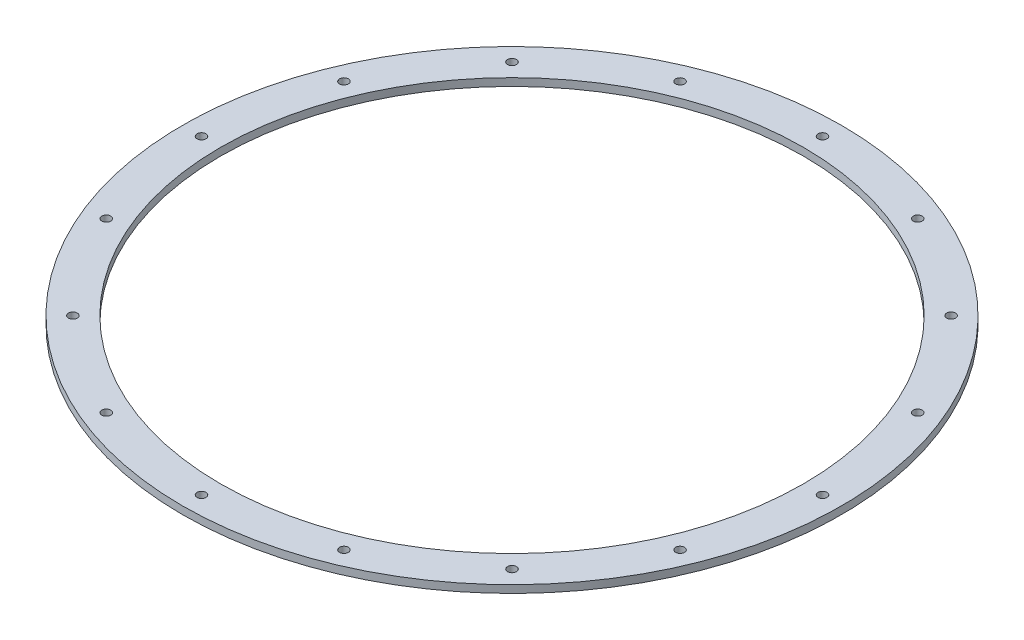
ISO-10303-21;
HEADER;
FILE_DESCRIPTION(('STEP AP214'),'2;1');
FILE_NAME('part.step','',(''),(''),'','','');
FILE_SCHEMA(('AUTOMOTIVE_DESIGN { 1 0 10303 214 1 1 1 1 }'));
ENDSEC;
DATA;
#1=APPLICATION_CONTEXT('core data for automotive mechanical design processes');
#2=APPLICATION_PROTOCOL_DEFINITION('international standard','automotive_design',2000,#1);
#3=PRODUCT_CONTEXT('',#1,'mechanical');
#4=PRODUCT('Part','Part','',(#3));
#5=PRODUCT_RELATED_PRODUCT_CATEGORY('part','',(#4));
#6=PRODUCT_DEFINITION_FORMATION('','',#4);
#7=PRODUCT_DEFINITION_CONTEXT('part definition',#1,'design');
#8=PRODUCT_DEFINITION('design','',#6,#7);
#9=PRODUCT_DEFINITION_SHAPE('','',#8);
#10=(LENGTH_UNIT() NAMED_UNIT(*) SI_UNIT(.MILLI.,.METRE.));
#11=(NAMED_UNIT(*) PLANE_ANGLE_UNIT() SI_UNIT($,.RADIAN.));
#12=(NAMED_UNIT(*) SI_UNIT($,.STERADIAN.) SOLID_ANGLE_UNIT());
#13=UNCERTAINTY_MEASURE_WITH_UNIT(LENGTH_MEASURE(1.E-05),#10,'distance_accuracy_value','');
#14=(GEOMETRIC_REPRESENTATION_CONTEXT(3) GLOBAL_UNCERTAINTY_ASSIGNED_CONTEXT((#13)) GLOBAL_UNIT_ASSIGNED_CONTEXT((#10,
#11,#12)) REPRESENTATION_CONTEXT('',''));
#15=CARTESIAN_POINT('',(0.,0.,0.));
#16=DIRECTION('',(0.,0.,1.));
#17=DIRECTION('',(1.,0.,0.));
#18=AXIS2_PLACEMENT_3D('',#15,#16,#17);
#19=CARTESIAN_POINT('',(0.,3.,0.));
#20=DIRECTION('',(0.,1.,0.));
#21=DIRECTION('',(0.,0.,1.));
#22=AXIS2_PLACEMENT_3D('',#19,#20,#21);
#23=PLANE('',#22);
#24=CARTESIAN_POINT('',(-172.887608000097,3.,-172.887608000076));
#25=DIRECTION('',(0.,1.,0.));
#26=DIRECTION('',(0.,0.,1.));
#27=AXIS2_PLACEMENT_3D('',#24,#25,#26);
#28=CIRCLE('',#27,3.49999999999999);
#29=CARTESIAN_POINT('',(-172.887608000097,3.,-169.387608000076));
#30=VERTEX_POINT('',#29);
#31=EDGE_CURVE('E134',#30,#30,#28,.T.);
#32=ORIENTED_EDGE('',*,*,#31,.F.);
#33=EDGE_LOOP('',(#32));
#34=FACE_BOUND('',#33,.T.);
#35=CARTESIAN_POINT('',(-244.499999999951,3.,4.86287843830169E-11));
#36=DIRECTION('',(0.,1.,0.));
#37=DIRECTION('',(0.,0.,1.));
#38=AXIS2_PLACEMENT_3D('',#35,#36,#37);
#39=CIRCLE('',#38,3.49999999999999);
#40=CARTESIAN_POINT('',(-244.499999999951,3.,3.50000000004862));
#41=VERTEX_POINT('',#40);
#42=EDGE_CURVE('E122',#41,#41,#39,.T.);
#43=ORIENTED_EDGE('',*,*,#42,.F.);
#44=EDGE_LOOP('',(#43));
#45=FACE_BOUND('',#44,.T.);
#46=CARTESIAN_POINT('',(-172.887608000028,3.,172.887608000145));
#47=DIRECTION('',(0.,1.,0.));
#48=DIRECTION('',(0.,0.,1.));
#49=AXIS2_PLACEMENT_3D('',#46,#47,#48);
#50=CIRCLE('',#49,3.49999999999999);
#51=CARTESIAN_POINT('',(-172.887608000028,3.,176.387608000145));
#52=VERTEX_POINT('',#51);
#53=EDGE_CURVE('E110',#52,#52,#50,.T.);
#54=ORIENTED_EDGE('',*,*,#53,.F.);
#55=EDGE_LOOP('',(#54));
#56=FACE_BOUND('',#55,.T.);
#57=CARTESIAN_POINT('',(9.71976835375555E-11,3.,244.5));
#58=DIRECTION('',(0.,1.,0.));
#59=DIRECTION('',(0.,0.,1.));
#60=AXIS2_PLACEMENT_3D('',#57,#58,#59);
#61=CIRCLE('',#60,3.5);
#62=CARTESIAN_POINT('',(9.71976835375555E-11,3.,248.));
#63=VERTEX_POINT('',#62);
#64=EDGE_CURVE('E98',#63,#63,#61,.T.);
#65=ORIENTED_EDGE('',*,*,#64,.F.);
#66=EDGE_LOOP('',(#65));
#67=FACE_BOUND('',#66,.T.);
#68=CARTESIAN_POINT('',(172.887608000194,3.,172.887608000076));
#69=DIRECTION('',(0.,1.,0.));
#70=DIRECTION('',(0.,0.,1.));
#71=AXIS2_PLACEMENT_3D('',#68,#69,#70);
#72=CIRCLE('',#71,3.49999999999999);
#73=CARTESIAN_POINT('',(172.887608000194,3.,176.387608000076));
#74=VERTEX_POINT('',#73);
#75=EDGE_CURVE('E86',#74,#74,#72,.T.);
#76=ORIENTED_EDGE('',*,*,#75,.F.);
#77=EDGE_LOOP('',(#76));
#78=FACE_BOUND('',#77,.T.);
#79=CARTESIAN_POINT('',(244.500000000049,3.,-4.85988417687777E-11));
#80=DIRECTION('',(0.,1.,0.));
#81=DIRECTION('',(0.,0.,1.));
#82=AXIS2_PLACEMENT_3D('',#79,#80,#81);
#83=CIRCLE('',#82,3.49999999999999);
#84=CARTESIAN_POINT('',(244.500000000049,3.,3.49999999995139));
#85=VERTEX_POINT('',#84);
#86=EDGE_CURVE('E74',#85,#85,#83,.T.);
#87=ORIENTED_EDGE('',*,*,#86,.F.);
#88=EDGE_LOOP('',(#87));
#89=FACE_BOUND('',#88,.T.);
#90=CARTESIAN_POINT('',(172.887608000125,3.,-172.887608000145));
#91=DIRECTION('',(0.,1.,0.));
#92=DIRECTION('',(0.,0.,1.));
#93=AXIS2_PLACEMENT_3D('',#90,#91,#92);
#94=CIRCLE('',#93,3.49999999999999);
#95=CARTESIAN_POINT('',(172.887608000125,3.,-169.387608000145));
#96=VERTEX_POINT('',#95);
#97=EDGE_CURVE('E62',#96,#96,#94,.T.);
#98=ORIENTED_EDGE('',*,*,#97,.F.);
#99=EDGE_LOOP('',(#98));
#100=FACE_BOUND('',#99,.T.);
#101=CARTESIAN_POINT('',(0.,3.,-244.5));
#102=DIRECTION('',(0.,1.,0.));
#103=DIRECTION('',(0.,0.,1.));
#104=AXIS2_PLACEMENT_3D('',#101,#102,#103);
#105=CIRCLE('',#104,3.5);
#106=CARTESIAN_POINT('',(0.,3.,-241.));
#107=VERTEX_POINT('',#106);
#108=EDGE_CURVE('E50',#107,#107,#105,.T.);
#109=ORIENTED_EDGE('',*,*,#108,.F.);
#110=EDGE_LOOP('',(#109));
#111=FACE_BOUND('',#110,.T.);
#112=CARTESIAN_POINT('',(0.,3.,0.));
#113=DIRECTION('',(0.,1.,0.));
#114=DIRECTION('',(0.,0.,1.));
#115=AXIS2_PLACEMENT_3D('',#112,#113,#114);
#116=CIRCLE('',#115,259.5);
#117=CARTESIAN_POINT('',(0.,3.,259.5));
#118=VERTEX_POINT('',#117);
#119=EDGE_CURVE('E10',#118,#118,#116,.T.);
#120=ORIENTED_EDGE('',*,*,#119,.T.);
#121=EDGE_LOOP('',(#120));
#122=FACE_BOUND('',#121,.T.);
#123=CARTESIAN_POINT('',(0.,3.,0.));
#124=DIRECTION('',(0.,1.,0.));
#125=DIRECTION('',(0.,0.,1.));
#126=AXIS2_PLACEMENT_3D('',#123,#124,#125);
#127=CIRCLE('',#126,229.5);
#128=CARTESIAN_POINT('',(0.,3.,229.5));
#129=VERTEX_POINT('',#128);
#130=EDGE_CURVE('E45',#129,#129,#127,.T.);
#131=ORIENTED_EDGE('',*,*,#130,.F.);
#132=EDGE_LOOP('',(#131));
#133=FACE_BOUND('',#132,.T.);
#134=CARTESIAN_POINT('',(93.566099213268,3.,-225.888545699028));
#135=DIRECTION('',(0.,1.,0.));
#136=DIRECTION('',(0.,0.,1.));
#137=AXIS2_PLACEMENT_3D('',#134,#135,#136);
#138=CIRCLE('',#137,3.50000000000001);
#139=CARTESIAN_POINT('',(93.566099213268,3.,-222.388545699028));
#140=VERTEX_POINT('',#139);
#141=EDGE_CURVE('E56',#140,#140,#138,.T.);
#142=ORIENTED_EDGE('',*,*,#141,.F.);
#143=EDGE_LOOP('',(#142));
#144=FACE_BOUND('',#143,.T.);
#145=CARTESIAN_POINT('',(225.88854569904,3.,-93.5660992133093));
#146=DIRECTION('',(0.,1.,0.));
#147=DIRECTION('',(0.,0.,1.));
#148=AXIS2_PLACEMENT_3D('',#145,#146,#147);
#149=CIRCLE('',#148,3.49999999999999);
#150=CARTESIAN_POINT('',(225.88854569904,3.,-90.0660992133094));
#151=VERTEX_POINT('',#150);
#152=EDGE_CURVE('E68',#151,#151,#149,.T.);
#153=ORIENTED_EDGE('',*,*,#152,.F.);
#154=EDGE_LOOP('',(#153));
#155=FACE_BOUND('',#154,.T.);
#156=CARTESIAN_POINT('',(225.888545699077,3.,93.5660992132196));
#157=DIRECTION('',(0.,1.,0.));
#158=DIRECTION('',(0.,0.,1.));
#159=AXIS2_PLACEMENT_3D('',#156,#157,#158);
#160=CIRCLE('',#159,3.49999999999999);
#161=CARTESIAN_POINT('',(225.888545699077,3.,97.0660992132195));
#162=VERTEX_POINT('',#161);
#163=EDGE_CURVE('E80',#162,#162,#160,.T.);
#164=ORIENTED_EDGE('',*,*,#163,.F.);
#165=EDGE_LOOP('',(#164));
#166=FACE_BOUND('',#165,.T.);
#167=CARTESIAN_POINT('',(93.5660992133579,3.,225.888545698991));
#168=DIRECTION('',(0.,1.,0.));
#169=DIRECTION('',(0.,0.,1.));
#170=AXIS2_PLACEMENT_3D('',#167,#168,#169);
#171=CIRCLE('',#170,3.50000000000001);
#172=CARTESIAN_POINT('',(93.5660992133579,3.,229.388545698991));
#173=VERTEX_POINT('',#172);
#174=EDGE_CURVE('E92',#173,#173,#171,.T.);
#175=ORIENTED_EDGE('',*,*,#174,.F.);
#176=EDGE_LOOP('',(#175));
#177=FACE_BOUND('',#176,.T.);
#178=CARTESIAN_POINT('',(-93.566099213171,3.,225.888545699028));
#179=DIRECTION('',(0.,1.,0.));
#180=DIRECTION('',(0.,0.,1.));
#181=AXIS2_PLACEMENT_3D('',#178,#179,#180);
#182=CIRCLE('',#181,3.50000000000001);
#183=CARTESIAN_POINT('',(-93.566099213171,3.,229.388545699028));
#184=VERTEX_POINT('',#183);
#185=EDGE_CURVE('E104',#184,#184,#182,.T.);
#186=ORIENTED_EDGE('',*,*,#185,.F.);
#187=EDGE_LOOP('',(#186));
#188=FACE_BOUND('',#187,.T.);
#189=CARTESIAN_POINT('',(-225.888545698942,3.,93.5660992133095));
#190=DIRECTION('',(0.,1.,0.));
#191=DIRECTION('',(0.,0.,1.));
#192=AXIS2_PLACEMENT_3D('',#189,#190,#191);
#193=CIRCLE('',#192,3.49999999999999);
#194=CARTESIAN_POINT('',(-225.888545698942,3.,97.0660992133095));
#195=VERTEX_POINT('',#194);
#196=EDGE_CURVE('E116',#195,#195,#193,.T.);
#197=ORIENTED_EDGE('',*,*,#196,.F.);
#198=EDGE_LOOP('',(#197));
#199=FACE_BOUND('',#198,.T.);
#200=CARTESIAN_POINT('',(-225.88854569898,3.,-93.5660992132196));
#201=DIRECTION('',(0.,1.,0.));
#202=DIRECTION('',(0.,0.,1.));
#203=AXIS2_PLACEMENT_3D('',#200,#201,#202);
#204=CIRCLE('',#203,3.49999999999999);
#205=CARTESIAN_POINT('',(-225.88854569898,3.,-90.0660992132196));
#206=VERTEX_POINT('',#205);
#207=EDGE_CURVE('E128',#206,#206,#204,.T.);
#208=ORIENTED_EDGE('',*,*,#207,.F.);
#209=EDGE_LOOP('',(#208));
#210=FACE_BOUND('',#209,.T.);
#211=CARTESIAN_POINT('',(-93.5660992132609,3.,-225.888545698991));
#212=DIRECTION('',(0.,1.,0.));
#213=DIRECTION('',(0.,0.,1.));
#214=AXIS2_PLACEMENT_3D('',#211,#212,#213);
#215=CIRCLE('',#214,3.50000000000001);
#216=CARTESIAN_POINT('',(-93.5660992132609,3.,-222.388545698991));
#217=VERTEX_POINT('',#216);
#218=EDGE_CURVE('E140',#217,#217,#215,.T.);
#219=ORIENTED_EDGE('',*,*,#218,.F.);
#220=EDGE_LOOP('',(#219));
#221=FACE_BOUND('',#220,.T.);
#222=ADVANCED_FACE('F34',(#34,#45,#56,#67,#78,#89,#100,#111,#122,#133,#144,#155,#166,#177,#188,
#199,#210,#221),#23,.T.);
#223=CARTESIAN_POINT('',(0.,-3.,0.));
#224=DIRECTION('',(0.,1.,0.));
#225=DIRECTION('',(0.,0.,1.));
#226=AXIS2_PLACEMENT_3D('',#223,#224,#225);
#227=PLANE('',#226);
#228=CARTESIAN_POINT('',(0.,-3.,0.));
#229=DIRECTION('',(0.,1.,0.));
#230=DIRECTION('',(0.,0.,1.));
#231=AXIS2_PLACEMENT_3D('',#228,#229,#230);
#232=CIRCLE('',#231,259.5);
#233=CARTESIAN_POINT('',(0.,-3.,259.5));
#234=VERTEX_POINT('',#233);
#235=EDGE_CURVE('E38',#234,#234,#232,.T.);
#236=ORIENTED_EDGE('',*,*,#235,.F.);
#237=EDGE_LOOP('',(#236));
#238=FACE_BOUND('',#237,.T.);
#239=CARTESIAN_POINT('',(0.,-3.,0.));
#240=DIRECTION('',(0.,1.,0.));
#241=DIRECTION('',(0.,0.,1.));
#242=AXIS2_PLACEMENT_3D('',#239,#240,#241);
#243=CIRCLE('',#242,229.5);
#244=CARTESIAN_POINT('',(0.,-3.,229.5));
#245=VERTEX_POINT('',#244);
#246=EDGE_CURVE('E47',#245,#245,#243,.T.);
#247=ORIENTED_EDGE('',*,*,#246,.T.);
#248=EDGE_LOOP('',(#247));
#249=FACE_BOUND('',#248,.T.);
#250=CARTESIAN_POINT('',(0.,-3.,-244.5));
#251=DIRECTION('',(0.,1.,0.));
#252=DIRECTION('',(0.,0.,1.));
#253=AXIS2_PLACEMENT_3D('',#250,#251,#252);
#254=CIRCLE('',#253,3.5);
#255=CARTESIAN_POINT('',(0.,-3.,-241.));
#256=VERTEX_POINT('',#255);
#257=EDGE_CURVE('E53',#256,#256,#254,.T.);
#258=ORIENTED_EDGE('',*,*,#257,.T.);
#259=EDGE_LOOP('',(#258));
#260=FACE_BOUND('',#259,.T.);
#261=CARTESIAN_POINT('',(93.566099213268,-3.,-225.888545699028));
#262=DIRECTION('',(0.,1.,0.));
#263=DIRECTION('',(0.,0.,1.));
#264=AXIS2_PLACEMENT_3D('',#261,#262,#263);
#265=CIRCLE('',#264,3.50000000000001);
#266=CARTESIAN_POINT('',(93.566099213268,-3.,-222.388545699028));
#267=VERTEX_POINT('',#266);
#268=EDGE_CURVE('E59',#267,#267,#265,.T.);
#269=ORIENTED_EDGE('',*,*,#268,.T.);
#270=EDGE_LOOP('',(#269));
#271=FACE_BOUND('',#270,.T.);
#272=CARTESIAN_POINT('',(172.887608000125,-3.,-172.887608000145));
#273=DIRECTION('',(0.,1.,0.));
#274=DIRECTION('',(0.,0.,1.));
#275=AXIS2_PLACEMENT_3D('',#272,#273,#274);
#276=CIRCLE('',#275,3.49999999999999);
#277=CARTESIAN_POINT('',(172.887608000125,-3.,-169.387608000145));
#278=VERTEX_POINT('',#277);
#279=EDGE_CURVE('E65',#278,#278,#276,.T.);
#280=ORIENTED_EDGE('',*,*,#279,.T.);
#281=EDGE_LOOP('',(#280));
#282=FACE_BOUND('',#281,.T.);
#283=CARTESIAN_POINT('',(225.88854569904,-3.,-93.5660992133093));
#284=DIRECTION('',(0.,1.,0.));
#285=DIRECTION('',(0.,0.,1.));
#286=AXIS2_PLACEMENT_3D('',#283,#284,#285);
#287=CIRCLE('',#286,3.49999999999999);
#288=CARTESIAN_POINT('',(225.88854569904,-3.,-90.0660992133094));
#289=VERTEX_POINT('',#288);
#290=EDGE_CURVE('E71',#289,#289,#287,.T.);
#291=ORIENTED_EDGE('',*,*,#290,.T.);
#292=EDGE_LOOP('',(#291));
#293=FACE_BOUND('',#292,.T.);
#294=CARTESIAN_POINT('',(244.500000000049,-3.,-4.85988417687777E-11));
#295=DIRECTION('',(0.,1.,0.));
#296=DIRECTION('',(0.,0.,1.));
#297=AXIS2_PLACEMENT_3D('',#294,#295,#296);
#298=CIRCLE('',#297,3.49999999999999);
#299=CARTESIAN_POINT('',(244.500000000049,-3.,3.49999999995139));
#300=VERTEX_POINT('',#299);
#301=EDGE_CURVE('E77',#300,#300,#298,.T.);
#302=ORIENTED_EDGE('',*,*,#301,.T.);
#303=EDGE_LOOP('',(#302));
#304=FACE_BOUND('',#303,.T.);
#305=CARTESIAN_POINT('',(225.888545699077,-3.,93.5660992132196));
#306=DIRECTION('',(0.,1.,0.));
#307=DIRECTION('',(0.,0.,1.));
#308=AXIS2_PLACEMENT_3D('',#305,#306,#307);
#309=CIRCLE('',#308,3.49999999999999);
#310=CARTESIAN_POINT('',(225.888545699077,-3.,97.0660992132195));
#311=VERTEX_POINT('',#310);
#312=EDGE_CURVE('E83',#311,#311,#309,.T.);
#313=ORIENTED_EDGE('',*,*,#312,.T.);
#314=EDGE_LOOP('',(#313));
#315=FACE_BOUND('',#314,.T.);
#316=CARTESIAN_POINT('',(172.887608000194,-3.,172.887608000076));
#317=DIRECTION('',(0.,1.,0.));
#318=DIRECTION('',(0.,0.,1.));
#319=AXIS2_PLACEMENT_3D('',#316,#317,#318);
#320=CIRCLE('',#319,3.49999999999999);
#321=CARTESIAN_POINT('',(172.887608000194,-3.,176.387608000076));
#322=VERTEX_POINT('',#321);
#323=EDGE_CURVE('E89',#322,#322,#320,.T.);
#324=ORIENTED_EDGE('',*,*,#323,.T.);
#325=EDGE_LOOP('',(#324));
#326=FACE_BOUND('',#325,.T.);
#327=CARTESIAN_POINT('',(93.5660992133579,-3.,225.888545698991));
#328=DIRECTION('',(0.,1.,0.));
#329=DIRECTION('',(0.,0.,1.));
#330=AXIS2_PLACEMENT_3D('',#327,#328,#329);
#331=CIRCLE('',#330,3.50000000000001);
#332=CARTESIAN_POINT('',(93.5660992133579,-3.,229.388545698991));
#333=VERTEX_POINT('',#332);
#334=EDGE_CURVE('E95',#333,#333,#331,.T.);
#335=ORIENTED_EDGE('',*,*,#334,.T.);
#336=EDGE_LOOP('',(#335));
#337=FACE_BOUND('',#336,.T.);
#338=CARTESIAN_POINT('',(9.71976835375555E-11,-3.,244.5));
#339=DIRECTION('',(0.,1.,0.));
#340=DIRECTION('',(0.,0.,1.));
#341=AXIS2_PLACEMENT_3D('',#338,#339,#340);
#342=CIRCLE('',#341,3.5);
#343=CARTESIAN_POINT('',(9.71976835375555E-11,-3.,248.));
#344=VERTEX_POINT('',#343);
#345=EDGE_CURVE('E101',#344,#344,#342,.T.);
#346=ORIENTED_EDGE('',*,*,#345,.T.);
#347=EDGE_LOOP('',(#346));
#348=FACE_BOUND('',#347,.T.);
#349=CARTESIAN_POINT('',(-93.566099213171,-3.,225.888545699028));
#350=DIRECTION('',(0.,1.,0.));
#351=DIRECTION('',(0.,0.,1.));
#352=AXIS2_PLACEMENT_3D('',#349,#350,#351);
#353=CIRCLE('',#352,3.50000000000001);
#354=CARTESIAN_POINT('',(-93.566099213171,-3.,229.388545699028));
#355=VERTEX_POINT('',#354);
#356=EDGE_CURVE('E107',#355,#355,#353,.T.);
#357=ORIENTED_EDGE('',*,*,#356,.T.);
#358=EDGE_LOOP('',(#357));
#359=FACE_BOUND('',#358,.T.);
#360=CARTESIAN_POINT('',(-172.887608000028,-3.,172.887608000145));
#361=DIRECTION('',(0.,1.,0.));
#362=DIRECTION('',(0.,0.,1.));
#363=AXIS2_PLACEMENT_3D('',#360,#361,#362);
#364=CIRCLE('',#363,3.49999999999999);
#365=CARTESIAN_POINT('',(-172.887608000028,-3.,176.387608000145));
#366=VERTEX_POINT('',#365);
#367=EDGE_CURVE('E113',#366,#366,#364,.T.);
#368=ORIENTED_EDGE('',*,*,#367,.T.);
#369=EDGE_LOOP('',(#368));
#370=FACE_BOUND('',#369,.T.);
#371=CARTESIAN_POINT('',(-225.888545698942,-3.,93.5660992133095));
#372=DIRECTION('',(0.,1.,0.));
#373=DIRECTION('',(0.,0.,1.));
#374=AXIS2_PLACEMENT_3D('',#371,#372,#373);
#375=CIRCLE('',#374,3.49999999999999);
#376=CARTESIAN_POINT('',(-225.888545698942,-3.,97.0660992133095));
#377=VERTEX_POINT('',#376);
#378=EDGE_CURVE('E119',#377,#377,#375,.T.);
#379=ORIENTED_EDGE('',*,*,#378,.T.);
#380=EDGE_LOOP('',(#379));
#381=FACE_BOUND('',#380,.T.);
#382=CARTESIAN_POINT('',(-244.499999999951,-3.,4.86287843830169E-11));
#383=DIRECTION('',(0.,1.,0.));
#384=DIRECTION('',(0.,0.,1.));
#385=AXIS2_PLACEMENT_3D('',#382,#383,#384);
#386=CIRCLE('',#385,3.49999999999999);
#387=CARTESIAN_POINT('',(-244.499999999951,-3.,3.50000000004862));
#388=VERTEX_POINT('',#387);
#389=EDGE_CURVE('E125',#388,#388,#386,.T.);
#390=ORIENTED_EDGE('',*,*,#389,.T.);
#391=EDGE_LOOP('',(#390));
#392=FACE_BOUND('',#391,.T.);
#393=CARTESIAN_POINT('',(-225.88854569898,-3.,-93.5660992132196));
#394=DIRECTION('',(0.,1.,0.));
#395=DIRECTION('',(0.,0.,1.));
#396=AXIS2_PLACEMENT_3D('',#393,#394,#395);
#397=CIRCLE('',#396,3.49999999999999);
#398=CARTESIAN_POINT('',(-225.88854569898,-3.,-90.0660992132196));
#399=VERTEX_POINT('',#398);
#400=EDGE_CURVE('E131',#399,#399,#397,.T.);
#401=ORIENTED_EDGE('',*,*,#400,.T.);
#402=EDGE_LOOP('',(#401));
#403=FACE_BOUND('',#402,.T.);
#404=CARTESIAN_POINT('',(-172.887608000097,-3.,-172.887608000076));
#405=DIRECTION('',(0.,1.,0.));
#406=DIRECTION('',(0.,0.,1.));
#407=AXIS2_PLACEMENT_3D('',#404,#405,#406);
#408=CIRCLE('',#407,3.49999999999999);
#409=CARTESIAN_POINT('',(-172.887608000097,-3.,-169.387608000076));
#410=VERTEX_POINT('',#409);
#411=EDGE_CURVE('E137',#410,#410,#408,.T.);
#412=ORIENTED_EDGE('',*,*,#411,.T.);
#413=EDGE_LOOP('',(#412));
#414=FACE_BOUND('',#413,.T.);
#415=CARTESIAN_POINT('',(-93.5660992132609,-3.,-225.888545698991));
#416=DIRECTION('',(0.,1.,0.));
#417=DIRECTION('',(0.,0.,1.));
#418=AXIS2_PLACEMENT_3D('',#415,#416,#417);
#419=CIRCLE('',#418,3.50000000000001);
#420=CARTESIAN_POINT('',(-93.5660992132609,-3.,-222.388545698991));
#421=VERTEX_POINT('',#420);
#422=EDGE_CURVE('E143',#421,#421,#419,.T.);
#423=ORIENTED_EDGE('',*,*,#422,.T.);
#424=EDGE_LOOP('',(#423));
#425=FACE_BOUND('',#424,.T.);
#426=ADVANCED_FACE('F153',(#238,#249,#260,#271,#282,#293,#304,#315,#326,#337,#348,#359,#370,
#381,#392,#403,#414,#425),#227,.F.);
#427=CARTESIAN_POINT('',(0.,3.,0.));
#428=DIRECTION('',(0.,-1.,0.));
#429=DIRECTION('',(0.,0.,-1.));
#430=AXIS2_PLACEMENT_3D('',#427,#428,#429);
#431=CYLINDRICAL_SURFACE('',#430,259.5);
#432=ORIENTED_EDGE('',*,*,#119,.F.);
#433=EDGE_LOOP('',(#432));
#434=FACE_BOUND('',#433,.T.);
#435=ORIENTED_EDGE('',*,*,#235,.T.);
#436=EDGE_LOOP('',(#435));
#437=FACE_BOUND('',#436,.T.);
#438=ADVANCED_FACE('F36',(#434,#437),#431,.T.);
#439=CARTESIAN_POINT('',(0.,3.,0.));
#440=DIRECTION('',(0.,-1.,0.));
#441=DIRECTION('',(0.,0.,-1.));
#442=AXIS2_PLACEMENT_3D('',#439,#440,#441);
#443=CYLINDRICAL_SURFACE('',#442,229.5);
#444=ORIENTED_EDGE('',*,*,#130,.T.);
#445=EDGE_LOOP('',(#444));
#446=FACE_BOUND('',#445,.T.);
#447=ORIENTED_EDGE('',*,*,#246,.F.);
#448=EDGE_LOOP('',(#447));
#449=FACE_BOUND('',#448,.T.);
#450=ADVANCED_FACE('F163',(#446,#449),#443,.F.);
#451=CARTESIAN_POINT('',(0.,3.,-244.5));
#452=DIRECTION('',(0.,-1.,0.));
#453=DIRECTION('',(0.,0.,-1.));
#454=AXIS2_PLACEMENT_3D('',#451,#452,#453);
#455=CYLINDRICAL_SURFACE('',#454,3.5);
#456=ORIENTED_EDGE('',*,*,#108,.T.);
#457=EDGE_LOOP('',(#456));
#458=FACE_BOUND('',#457,.T.);
#459=ORIENTED_EDGE('',*,*,#257,.F.);
#460=EDGE_LOOP('',(#459));
#461=FACE_BOUND('',#460,.T.);
#462=ADVANCED_FACE('F166',(#458,#461),#455,.F.);
#463=CARTESIAN_POINT('',(93.566099213268,3.,-225.888545699028));
#464=DIRECTION('',(0.,-1.,0.));
#465=DIRECTION('',(0.,0.,-1.));
#466=AXIS2_PLACEMENT_3D('',#463,#464,#465);
#467=CYLINDRICAL_SURFACE('',#466,3.50000000000001);
#468=ORIENTED_EDGE('',*,*,#141,.T.);
#469=EDGE_LOOP('',(#468));
#470=FACE_BOUND('',#469,.T.);
#471=ORIENTED_EDGE('',*,*,#268,.F.);
#472=EDGE_LOOP('',(#471));
#473=FACE_BOUND('',#472,.T.);
#474=ADVANCED_FACE('F170',(#470,#473),#467,.F.);
#475=CARTESIAN_POINT('',(172.887608000125,3.,-172.887608000145));
#476=DIRECTION('',(0.,-1.,0.));
#477=DIRECTION('',(0.,0.,-1.));
#478=AXIS2_PLACEMENT_3D('',#475,#476,#477);
#479=CYLINDRICAL_SURFACE('',#478,3.49999999999999);
#480=ORIENTED_EDGE('',*,*,#97,.T.);
#481=EDGE_LOOP('',(#480));
#482=FACE_BOUND('',#481,.T.);
#483=ORIENTED_EDGE('',*,*,#279,.F.);
#484=EDGE_LOOP('',(#483));
#485=FACE_BOUND('',#484,.T.);
#486=ADVANCED_FACE('F174',(#482,#485),#479,.F.);
#487=CARTESIAN_POINT('',(225.88854569904,3.,-93.5660992133093));
#488=DIRECTION('',(0.,-1.,0.));
#489=DIRECTION('',(0.,0.,-1.));
#490=AXIS2_PLACEMENT_3D('',#487,#488,#489);
#491=CYLINDRICAL_SURFACE('',#490,3.49999999999999);
#492=ORIENTED_EDGE('',*,*,#152,.T.);
#493=EDGE_LOOP('',(#492));
#494=FACE_BOUND('',#493,.T.);
#495=ORIENTED_EDGE('',*,*,#290,.F.);
#496=EDGE_LOOP('',(#495));
#497=FACE_BOUND('',#496,.T.);
#498=ADVANCED_FACE('F178',(#494,#497),#491,.F.);
#499=CARTESIAN_POINT('',(244.500000000049,3.,-4.85988417687777E-11));
#500=DIRECTION('',(0.,-1.,0.));
#501=DIRECTION('',(0.,0.,-1.));
#502=AXIS2_PLACEMENT_3D('',#499,#500,#501);
#503=CYLINDRICAL_SURFACE('',#502,3.49999999999999);
#504=ORIENTED_EDGE('',*,*,#86,.T.);
#505=EDGE_LOOP('',(#504));
#506=FACE_BOUND('',#505,.T.);
#507=ORIENTED_EDGE('',*,*,#301,.F.);
#508=EDGE_LOOP('',(#507));
#509=FACE_BOUND('',#508,.T.);
#510=ADVANCED_FACE('F182',(#506,#509),#503,.F.);
#511=CARTESIAN_POINT('',(225.888545699077,3.,93.5660992132196));
#512=DIRECTION('',(0.,-1.,0.));
#513=DIRECTION('',(0.,0.,-1.));
#514=AXIS2_PLACEMENT_3D('',#511,#512,#513);
#515=CYLINDRICAL_SURFACE('',#514,3.49999999999999);
#516=ORIENTED_EDGE('',*,*,#163,.T.);
#517=EDGE_LOOP('',(#516));
#518=FACE_BOUND('',#517,.T.);
#519=ORIENTED_EDGE('',*,*,#312,.F.);
#520=EDGE_LOOP('',(#519));
#521=FACE_BOUND('',#520,.T.);
#522=ADVANCED_FACE('F186',(#518,#521),#515,.F.);
#523=CARTESIAN_POINT('',(172.887608000194,3.,172.887608000076));
#524=DIRECTION('',(0.,-1.,0.));
#525=DIRECTION('',(0.,0.,-1.));
#526=AXIS2_PLACEMENT_3D('',#523,#524,#525);
#527=CYLINDRICAL_SURFACE('',#526,3.49999999999999);
#528=ORIENTED_EDGE('',*,*,#75,.T.);
#529=EDGE_LOOP('',(#528));
#530=FACE_BOUND('',#529,.T.);
#531=ORIENTED_EDGE('',*,*,#323,.F.);
#532=EDGE_LOOP('',(#531));
#533=FACE_BOUND('',#532,.T.);
#534=ADVANCED_FACE('F190',(#530,#533),#527,.F.);
#535=CARTESIAN_POINT('',(93.5660992133579,3.,225.888545698991));
#536=DIRECTION('',(0.,-1.,0.));
#537=DIRECTION('',(0.,0.,-1.));
#538=AXIS2_PLACEMENT_3D('',#535,#536,#537);
#539=CYLINDRICAL_SURFACE('',#538,3.50000000000001);
#540=ORIENTED_EDGE('',*,*,#174,.T.);
#541=EDGE_LOOP('',(#540));
#542=FACE_BOUND('',#541,.T.);
#543=ORIENTED_EDGE('',*,*,#334,.F.);
#544=EDGE_LOOP('',(#543));
#545=FACE_BOUND('',#544,.T.);
#546=ADVANCED_FACE('F194',(#542,#545),#539,.F.);
#547=CARTESIAN_POINT('',(9.71976835375555E-11,3.,244.5));
#548=DIRECTION('',(0.,-1.,0.));
#549=DIRECTION('',(0.,0.,-1.));
#550=AXIS2_PLACEMENT_3D('',#547,#548,#549);
#551=CYLINDRICAL_SURFACE('',#550,3.5);
#552=ORIENTED_EDGE('',*,*,#64,.T.);
#553=EDGE_LOOP('',(#552));
#554=FACE_BOUND('',#553,.T.);
#555=ORIENTED_EDGE('',*,*,#345,.F.);
#556=EDGE_LOOP('',(#555));
#557=FACE_BOUND('',#556,.T.);
#558=ADVANCED_FACE('F198',(#554,#557),#551,.F.);
#559=CARTESIAN_POINT('',(-93.566099213171,3.,225.888545699028));
#560=DIRECTION('',(0.,-1.,0.));
#561=DIRECTION('',(0.,0.,-1.));
#562=AXIS2_PLACEMENT_3D('',#559,#560,#561);
#563=CYLINDRICAL_SURFACE('',#562,3.50000000000001);
#564=ORIENTED_EDGE('',*,*,#185,.T.);
#565=EDGE_LOOP('',(#564));
#566=FACE_BOUND('',#565,.T.);
#567=ORIENTED_EDGE('',*,*,#356,.F.);
#568=EDGE_LOOP('',(#567));
#569=FACE_BOUND('',#568,.T.);
#570=ADVANCED_FACE('F202',(#566,#569),#563,.F.);
#571=CARTESIAN_POINT('',(-172.887608000028,3.,172.887608000145));
#572=DIRECTION('',(0.,-1.,0.));
#573=DIRECTION('',(0.,0.,-1.));
#574=AXIS2_PLACEMENT_3D('',#571,#572,#573);
#575=CYLINDRICAL_SURFACE('',#574,3.49999999999999);
#576=ORIENTED_EDGE('',*,*,#53,.T.);
#577=EDGE_LOOP('',(#576));
#578=FACE_BOUND('',#577,.T.);
#579=ORIENTED_EDGE('',*,*,#367,.F.);
#580=EDGE_LOOP('',(#579));
#581=FACE_BOUND('',#580,.T.);
#582=ADVANCED_FACE('F206',(#578,#581),#575,.F.);
#583=CARTESIAN_POINT('',(-225.888545698942,3.,93.5660992133095));
#584=DIRECTION('',(0.,-1.,0.));
#585=DIRECTION('',(0.,0.,-1.));
#586=AXIS2_PLACEMENT_3D('',#583,#584,#585);
#587=CYLINDRICAL_SURFACE('',#586,3.49999999999999);
#588=ORIENTED_EDGE('',*,*,#196,.T.);
#589=EDGE_LOOP('',(#588));
#590=FACE_BOUND('',#589,.T.);
#591=ORIENTED_EDGE('',*,*,#378,.F.);
#592=EDGE_LOOP('',(#591));
#593=FACE_BOUND('',#592,.T.);
#594=ADVANCED_FACE('F210',(#590,#593),#587,.F.);
#595=CARTESIAN_POINT('',(-244.499999999951,3.,4.86287843830169E-11));
#596=DIRECTION('',(0.,-1.,0.));
#597=DIRECTION('',(0.,0.,-1.));
#598=AXIS2_PLACEMENT_3D('',#595,#596,#597);
#599=CYLINDRICAL_SURFACE('',#598,3.49999999999999);
#600=ORIENTED_EDGE('',*,*,#42,.T.);
#601=EDGE_LOOP('',(#600));
#602=FACE_BOUND('',#601,.T.);
#603=ORIENTED_EDGE('',*,*,#389,.F.);
#604=EDGE_LOOP('',(#603));
#605=FACE_BOUND('',#604,.T.);
#606=ADVANCED_FACE('F214',(#602,#605),#599,.F.);
#607=CARTESIAN_POINT('',(-225.88854569898,3.,-93.5660992132196));
#608=DIRECTION('',(0.,-1.,0.));
#609=DIRECTION('',(0.,0.,-1.));
#610=AXIS2_PLACEMENT_3D('',#607,#608,#609);
#611=CYLINDRICAL_SURFACE('',#610,3.49999999999999);
#612=ORIENTED_EDGE('',*,*,#207,.T.);
#613=EDGE_LOOP('',(#612));
#614=FACE_BOUND('',#613,.T.);
#615=ORIENTED_EDGE('',*,*,#400,.F.);
#616=EDGE_LOOP('',(#615));
#617=FACE_BOUND('',#616,.T.);
#618=ADVANCED_FACE('F218',(#614,#617),#611,.F.);
#619=CARTESIAN_POINT('',(-172.887608000097,3.,-172.887608000076));
#620=DIRECTION('',(0.,-1.,0.));
#621=DIRECTION('',(0.,0.,-1.));
#622=AXIS2_PLACEMENT_3D('',#619,#620,#621);
#623=CYLINDRICAL_SURFACE('',#622,3.49999999999999);
#624=ORIENTED_EDGE('',*,*,#31,.T.);
#625=EDGE_LOOP('',(#624));
#626=FACE_BOUND('',#625,.T.);
#627=ORIENTED_EDGE('',*,*,#411,.F.);
#628=EDGE_LOOP('',(#627));
#629=FACE_BOUND('',#628,.T.);
#630=ADVANCED_FACE('F222',(#626,#629),#623,.F.);
#631=CARTESIAN_POINT('',(-93.5660992132609,3.,-225.888545698991));
#632=DIRECTION('',(0.,-1.,0.));
#633=DIRECTION('',(0.,0.,-1.));
#634=AXIS2_PLACEMENT_3D('',#631,#632,#633);
#635=CYLINDRICAL_SURFACE('',#634,3.50000000000001);
#636=ORIENTED_EDGE('',*,*,#218,.T.);
#637=EDGE_LOOP('',(#636));
#638=FACE_BOUND('',#637,.T.);
#639=ORIENTED_EDGE('',*,*,#422,.F.);
#640=EDGE_LOOP('',(#639));
#641=FACE_BOUND('',#640,.T.);
#642=ADVANCED_FACE('F149',(#638,#641),#635,.F.);
#643=CLOSED_SHELL('',(#222,#426,#438,#450,#462,#474,#486,#498,#510,#522,#534,#546,#558,#570,
#582,#594,#606,#618,#630,#642));
#644=MANIFOLD_SOLID_BREP('B2',#643);
#645=ADVANCED_BREP_SHAPE_REPRESENTATION('',(#18,#644),#14);
#646=SHAPE_DEFINITION_REPRESENTATION(#9,#645);
ENDSEC;
END-ISO-10303-21;
